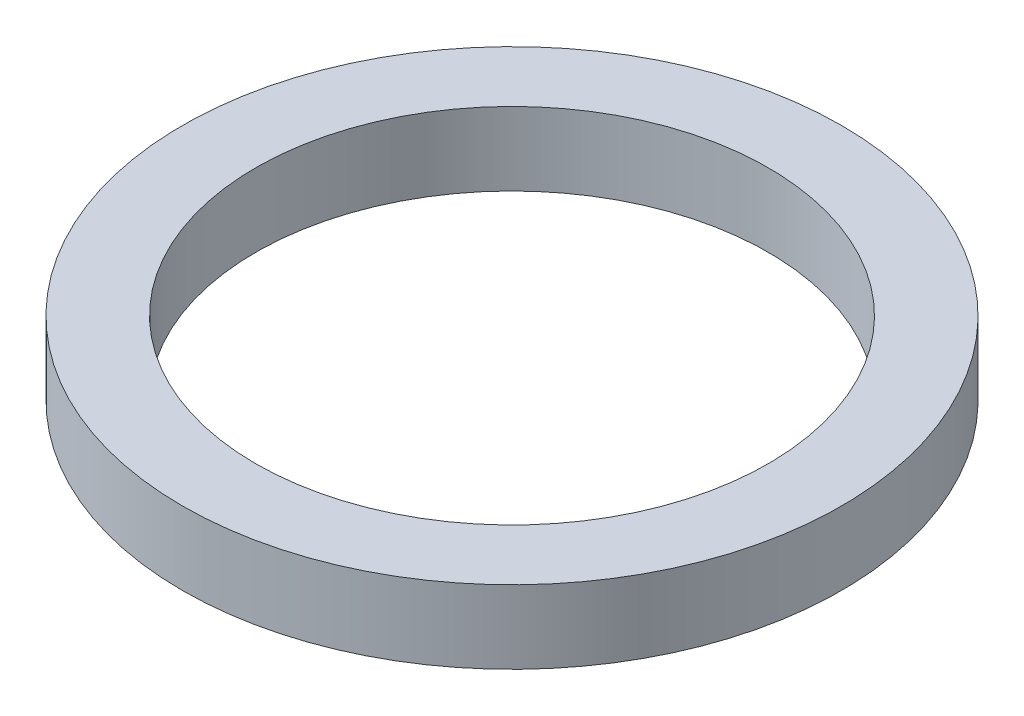
ISO-10303-21;
HEADER;
FILE_DESCRIPTION(('STEP AP214'),'2;1');
FILE_NAME('part.step','',(''),(''),'','','');
FILE_SCHEMA(('AUTOMOTIVE_DESIGN { 1 0 10303 214 1 1 1 1 }'));
ENDSEC;
DATA;
#1=APPLICATION_CONTEXT('core data for automotive mechanical design processes');
#2=APPLICATION_PROTOCOL_DEFINITION('international standard','automotive_design',2000,#1);
#3=PRODUCT_CONTEXT('',#1,'mechanical');
#4=PRODUCT('Part','Part','',(#3));
#5=PRODUCT_RELATED_PRODUCT_CATEGORY('part','',(#4));
#6=PRODUCT_DEFINITION_FORMATION('','',#4);
#7=PRODUCT_DEFINITION_CONTEXT('part definition',#1,'design');
#8=PRODUCT_DEFINITION('design','',#6,#7);
#9=PRODUCT_DEFINITION_SHAPE('','',#8);
#10=(LENGTH_UNIT() NAMED_UNIT(*) SI_UNIT(.MILLI.,.METRE.));
#11=(NAMED_UNIT(*) PLANE_ANGLE_UNIT() SI_UNIT($,.RADIAN.));
#12=(NAMED_UNIT(*) SI_UNIT($,.STERADIAN.) SOLID_ANGLE_UNIT());
#13=UNCERTAINTY_MEASURE_WITH_UNIT(LENGTH_MEASURE(1.E-05),#10,'distance_accuracy_value','');
#14=(GEOMETRIC_REPRESENTATION_CONTEXT(3) GLOBAL_UNCERTAINTY_ASSIGNED_CONTEXT((#13)) GLOBAL_UNIT_ASSIGNED_CONTEXT((#10,
#11,#12)) REPRESENTATION_CONTEXT('',''));
#15=CARTESIAN_POINT('',(0.,0.,0.));
#16=DIRECTION('',(0.,0.,1.));
#17=DIRECTION('',(1.,0.,0.));
#18=AXIS2_PLACEMENT_3D('',#15,#16,#17);
#19=CARTESIAN_POINT('',(0.,10.,0.));
#20=DIRECTION('',(0.,1.,0.));
#21=DIRECTION('',(0.,0.,1.));
#22=AXIS2_PLACEMENT_3D('',#19,#20,#21);
#23=PLANE('',#22);
#24=CARTESIAN_POINT('',(0.,10.,0.));
#25=DIRECTION('',(0.,1.,0.));
#26=DIRECTION('',(0.,0.,1.));
#27=AXIS2_PLACEMENT_3D('',#24,#25,#26);
#28=CIRCLE('',#27,45.);
#29=CARTESIAN_POINT('',(0.,10.,45.));
#30=VERTEX_POINT('',#29);
#31=EDGE_CURVE('E10',#30,#30,#28,.T.);
#32=ORIENTED_EDGE('',*,*,#31,.T.);
#33=EDGE_LOOP('',(#32));
#34=FACE_BOUND('',#33,.T.);
#35=CARTESIAN_POINT('',(0.,10.,0.));
#36=DIRECTION('',(0.,1.,0.));
#37=DIRECTION('',(0.,0.,1.));
#38=AXIS2_PLACEMENT_3D('',#35,#36,#37);
#39=CIRCLE('',#38,35.);
#40=CARTESIAN_POINT('',(0.,10.,35.));
#41=VERTEX_POINT('',#40);
#42=EDGE_CURVE('E44',#41,#41,#39,.T.);
#43=ORIENTED_EDGE('',*,*,#42,.F.);
#44=EDGE_LOOP('',(#43));
#45=FACE_BOUND('',#44,.T.);
#46=ADVANCED_FACE('F33',(#34,#45),#23,.T.);
#47=CARTESIAN_POINT('',(0.,0.,0.));
#48=DIRECTION('',(0.,1.,0.));
#49=DIRECTION('',(0.,0.,1.));
#50=AXIS2_PLACEMENT_3D('',#47,#48,#49);
#51=PLANE('',#50);
#52=CARTESIAN_POINT('',(0.,0.,0.));
#53=DIRECTION('',(0.,1.,0.));
#54=DIRECTION('',(0.,0.,1.));
#55=AXIS2_PLACEMENT_3D('',#52,#53,#54);
#56=CIRCLE('',#55,45.);
#57=CARTESIAN_POINT('',(0.,0.,45.));
#58=VERTEX_POINT('',#57);
#59=EDGE_CURVE('E37',#58,#58,#56,.T.);
#60=ORIENTED_EDGE('',*,*,#59,.F.);
#61=EDGE_LOOP('',(#60));
#62=FACE_BOUND('',#61,.T.);
#63=CARTESIAN_POINT('',(0.,0.,0.));
#64=DIRECTION('',(0.,1.,0.));
#65=DIRECTION('',(0.,0.,1.));
#66=AXIS2_PLACEMENT_3D('',#63,#64,#65);
#67=CIRCLE('',#66,35.);
#68=CARTESIAN_POINT('',(0.,0.,35.));
#69=VERTEX_POINT('',#68);
#70=EDGE_CURVE('E46',#69,#69,#67,.T.);
#71=ORIENTED_EDGE('',*,*,#70,.T.);
#72=EDGE_LOOP('',(#71));
#73=FACE_BOUND('',#72,.T.);
#74=ADVANCED_FACE('F56',(#62,#73),#51,.F.);
#75=CARTESIAN_POINT('',(0.,10.,0.));
#76=DIRECTION('',(0.,-1.,0.));
#77=DIRECTION('',(0.,0.,-1.));
#78=AXIS2_PLACEMENT_3D('',#75,#76,#77);
#79=CYLINDRICAL_SURFACE('',#78,45.);
#80=ORIENTED_EDGE('',*,*,#31,.F.);
#81=EDGE_LOOP('',(#80));
#82=FACE_BOUND('',#81,.T.);
#83=ORIENTED_EDGE('',*,*,#59,.T.);
#84=EDGE_LOOP('',(#83));
#85=FACE_BOUND('',#84,.T.);
#86=ADVANCED_FACE('F35',(#82,#85),#79,.T.);
#87=CARTESIAN_POINT('',(0.,10.,0.));
#88=DIRECTION('',(0.,-1.,0.));
#89=DIRECTION('',(0.,0.,-1.));
#90=AXIS2_PLACEMENT_3D('',#87,#88,#89);
#91=CYLINDRICAL_SURFACE('',#90,35.);
#92=ORIENTED_EDGE('',*,*,#42,.T.);
#93=EDGE_LOOP('',(#92));
#94=FACE_BOUND('',#93,.T.);
#95=ORIENTED_EDGE('',*,*,#70,.F.);
#96=EDGE_LOOP('',(#95));
#97=FACE_BOUND('',#96,.T.);
#98=ADVANCED_FACE('F52',(#94,#97),#91,.F.);
#99=CLOSED_SHELL('',(#46,#74,#86,#98));
#100=MANIFOLD_SOLID_BREP('B2',#99);
#101=ADVANCED_BREP_SHAPE_REPRESENTATION('',(#18,#100),#14);
#102=SHAPE_DEFINITION_REPRESENTATION(#9,#101);
ENDSEC;
END-ISO-10303-21;
